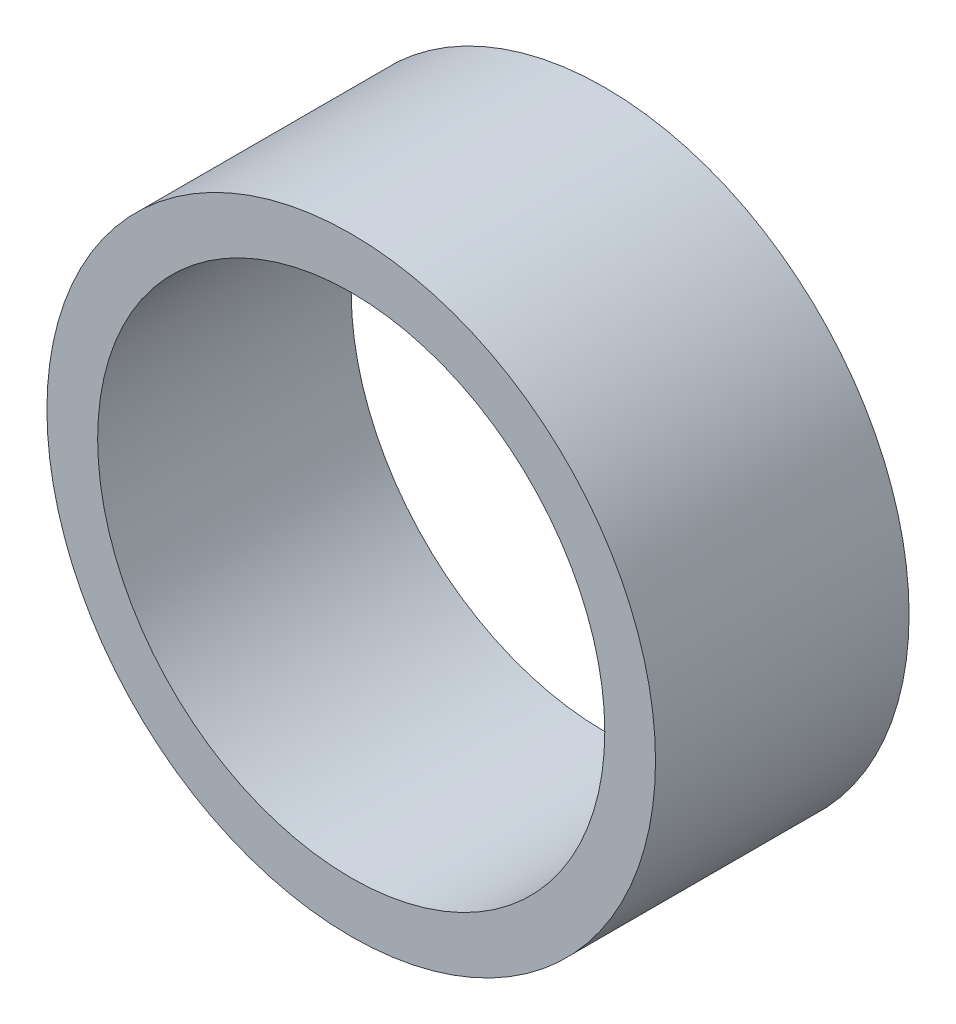
ISO-10303-21;
HEADER;
FILE_DESCRIPTION(('STEP AP214'),'2;1');
FILE_NAME('part.step','',(''),(''),'','','');
FILE_SCHEMA(('AUTOMOTIVE_DESIGN { 1 0 10303 214 1 1 1 1 }'));
ENDSEC;
DATA;
#1=APPLICATION_CONTEXT('core data for automotive mechanical design processes');
#2=APPLICATION_PROTOCOL_DEFINITION('international standard','automotive_design',2000,#1);
#3=PRODUCT_CONTEXT('',#1,'mechanical');
#4=PRODUCT('Part','Part','',(#3));
#5=PRODUCT_RELATED_PRODUCT_CATEGORY('part','',(#4));
#6=PRODUCT_DEFINITION_FORMATION('','',#4);
#7=PRODUCT_DEFINITION_CONTEXT('part definition',#1,'design');
#8=PRODUCT_DEFINITION('design','',#6,#7);
#9=PRODUCT_DEFINITION_SHAPE('','',#8);
#10=(LENGTH_UNIT() NAMED_UNIT(*) SI_UNIT(.MILLI.,.METRE.));
#11=(NAMED_UNIT(*) PLANE_ANGLE_UNIT() SI_UNIT($,.RADIAN.));
#12=(NAMED_UNIT(*) SI_UNIT($,.STERADIAN.) SOLID_ANGLE_UNIT());
#13=UNCERTAINTY_MEASURE_WITH_UNIT(LENGTH_MEASURE(1.E-05),#10,'distance_accuracy_value','');
#14=(GEOMETRIC_REPRESENTATION_CONTEXT(3) GLOBAL_UNCERTAINTY_ASSIGNED_CONTEXT((#13)) GLOBAL_UNIT_ASSIGNED_CONTEXT((#10,
#11,#12)) REPRESENTATION_CONTEXT('',''));
#15=CARTESIAN_POINT('',(0.,0.,0.));
#16=DIRECTION('',(0.,0.,1.));
#17=DIRECTION('',(1.,0.,0.));
#18=AXIS2_PLACEMENT_3D('',#15,#16,#17);
#19=CARTESIAN_POINT('',(0.,0.,5.));
#20=DIRECTION('',(0.,0.,1.));
#21=DIRECTION('',(1.,0.,0.));
#22=AXIS2_PLACEMENT_3D('',#19,#20,#21);
#23=PLANE('',#22);
#24=CARTESIAN_POINT('',(0.,0.,5.));
#25=DIRECTION('',(0.,0.,1.));
#26=DIRECTION('',(1.,0.,0.));
#27=AXIS2_PLACEMENT_3D('',#24,#25,#26);
#28=CIRCLE('',#27,6.);
#29=CARTESIAN_POINT('',(6.,0.,5.));
#30=VERTEX_POINT('',#29);
#31=EDGE_CURVE('E10',#30,#30,#28,.T.);
#32=ORIENTED_EDGE('',*,*,#31,.T.);
#33=EDGE_LOOP('',(#32));
#34=FACE_BOUND('',#33,.T.);
#35=CARTESIAN_POINT('',(0.,0.,5.));
#36=DIRECTION('',(0.,0.,1.));
#37=DIRECTION('',(1.,0.,0.));
#38=AXIS2_PLACEMENT_3D('',#35,#36,#37);
#39=CIRCLE('',#38,5.);
#40=CARTESIAN_POINT('',(5.,0.,5.));
#41=VERTEX_POINT('',#40);
#42=EDGE_CURVE('E50',#41,#41,#39,.T.);
#43=ORIENTED_EDGE('',*,*,#42,.F.);
#44=EDGE_LOOP('',(#43));
#45=FACE_BOUND('',#44,.T.);
#46=ADVANCED_FACE('F37',(#34,#45),#23,.T.);
#47=CARTESIAN_POINT('',(0.,0.,0.));
#48=DIRECTION('',(0.,0.,1.));
#49=DIRECTION('',(1.,0.,0.));
#50=AXIS2_PLACEMENT_3D('',#47,#48,#49);
#51=PLANE('',#50);
#52=CARTESIAN_POINT('',(0.,0.,0.));
#53=DIRECTION('',(0.,0.,1.));
#54=DIRECTION('',(1.,0.,0.));
#55=AXIS2_PLACEMENT_3D('',#52,#53,#54);
#56=CIRCLE('',#55,6.);
#57=CARTESIAN_POINT('',(6.,0.,0.));
#58=VERTEX_POINT('',#57);
#59=EDGE_CURVE('E41',#58,#58,#56,.T.);
#60=ORIENTED_EDGE('',*,*,#59,.F.);
#61=EDGE_LOOP('',(#60));
#62=FACE_BOUND('',#61,.T.);
#63=CARTESIAN_POINT('',(0.,0.,0.));
#64=DIRECTION('',(0.,0.,1.));
#65=DIRECTION('',(1.,0.,0.));
#66=AXIS2_PLACEMENT_3D('',#63,#64,#65);
#67=CIRCLE('',#66,5.);
#68=CARTESIAN_POINT('',(5.,0.,0.));
#69=VERTEX_POINT('',#68);
#70=EDGE_CURVE('E52',#69,#69,#67,.T.);
#71=ORIENTED_EDGE('',*,*,#70,.T.);
#72=EDGE_LOOP('',(#71));
#73=FACE_BOUND('',#72,.T.);
#74=ADVANCED_FACE('F64',(#62,#73),#51,.F.);
#75=CARTESIAN_POINT('',(0.,0.,5.));
#76=DIRECTION('',(0.,0.,-1.));
#77=DIRECTION('',(-1.,0.,0.));
#78=AXIS2_PLACEMENT_3D('',#75,#76,#77);
#79=CYLINDRICAL_SURFACE('',#78,6.);
#80=ORIENTED_EDGE('',*,*,#31,.F.);
#81=EDGE_LOOP('',(#80));
#82=FACE_BOUND('',#81,.T.);
#83=ORIENTED_EDGE('',*,*,#59,.T.);
#84=EDGE_LOOP('',(#83));
#85=FACE_BOUND('',#84,.T.);
#86=ADVANCED_FACE('F39',(#82,#85),#79,.T.);
#87=CARTESIAN_POINT('',(0.,0.,5.));
#88=DIRECTION('',(0.,0.,-1.));
#89=DIRECTION('',(-1.,0.,0.));
#90=AXIS2_PLACEMENT_3D('',#87,#88,#89);
#91=CYLINDRICAL_SURFACE('',#90,5.);
#92=ORIENTED_EDGE('',*,*,#42,.T.);
#93=EDGE_LOOP('',(#92));
#94=FACE_BOUND('',#93,.T.);
#95=ORIENTED_EDGE('',*,*,#70,.F.);
#96=EDGE_LOOP('',(#95));
#97=FACE_BOUND('',#96,.T.);
#98=ADVANCED_FACE('F60',(#94,#97),#91,.F.);
#99=CLOSED_SHELL('',(#46,#74,#86,#98));
#100=MANIFOLD_SOLID_BREP('B2',#99);
#101=ADVANCED_BREP_SHAPE_REPRESENTATION('',(#18,#100),#14);
#102=SHAPE_DEFINITION_REPRESENTATION(#9,#101);
ENDSEC;
END-ISO-10303-21;
